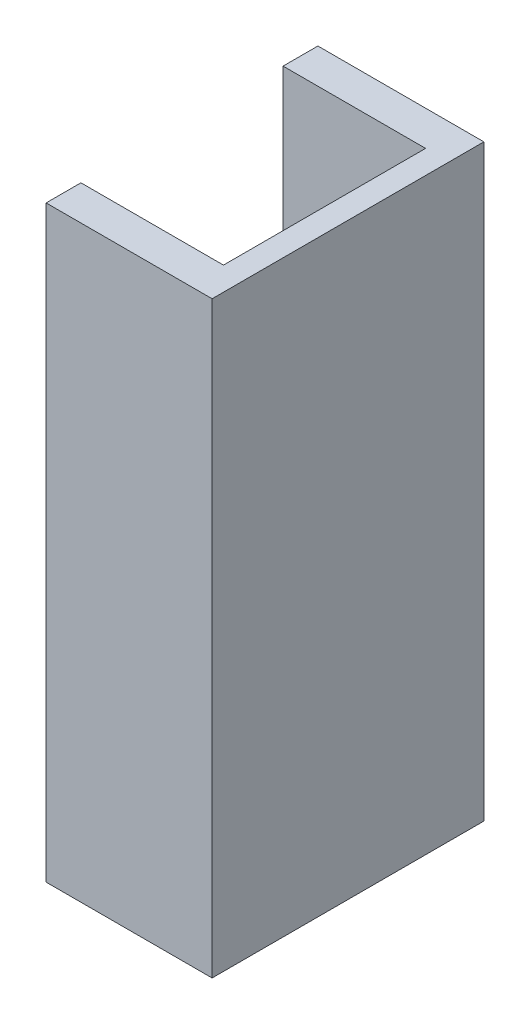
ISO-10303-21;
HEADER;
FILE_DESCRIPTION(('STEP AP214'),'2;1');
FILE_NAME('part.step','',(''),(''),'','','');
FILE_SCHEMA(('AUTOMOTIVE_DESIGN { 1 0 10303 214 1 1 1 1 }'));
ENDSEC;
DATA;
#1=APPLICATION_CONTEXT('core data for automotive mechanical design processes');
#2=APPLICATION_PROTOCOL_DEFINITION('international standard','automotive_design',2000,#1);
#3=PRODUCT_CONTEXT('',#1,'mechanical');
#4=PRODUCT('Part','Part','',(#3));
#5=PRODUCT_RELATED_PRODUCT_CATEGORY('part','',(#4));
#6=PRODUCT_DEFINITION_FORMATION('','',#4);
#7=PRODUCT_DEFINITION_CONTEXT('part definition',#1,'design');
#8=PRODUCT_DEFINITION('design','',#6,#7);
#9=PRODUCT_DEFINITION_SHAPE('','',#8);
#10=(LENGTH_UNIT() NAMED_UNIT(*) SI_UNIT(.MILLI.,.METRE.));
#11=(NAMED_UNIT(*) PLANE_ANGLE_UNIT() SI_UNIT($,.RADIAN.));
#12=(NAMED_UNIT(*) SI_UNIT($,.STERADIAN.) SOLID_ANGLE_UNIT());
#13=UNCERTAINTY_MEASURE_WITH_UNIT(LENGTH_MEASURE(1.E-05),#10,'distance_accuracy_value','');
#14=(GEOMETRIC_REPRESENTATION_CONTEXT(3) GLOBAL_UNCERTAINTY_ASSIGNED_CONTEXT((#13)) GLOBAL_UNIT_ASSIGNED_CONTEXT((#10,
#11,#12)) REPRESENTATION_CONTEXT('',''));
#15=CARTESIAN_POINT('',(0.,0.,0.));
#16=DIRECTION('',(0.,0.,1.));
#17=DIRECTION('',(1.,0.,0.));
#18=AXIS2_PLACEMENT_3D('',#15,#16,#17);
#19=CARTESIAN_POINT('',(18.9,-110.,18.9));
#20=DIRECTION('',(-1.,0.,0.));
#21=DIRECTION('',(0.,0.,1.));
#22=AXIS2_PLACEMENT_3D('',#19,#20,#21);
#23=PLANE('',#22);
#24=DIRECTION('',(0.,0.,1.));
#25=VECTOR('',#24,1.);
#26=CARTESIAN_POINT('',(18.9,0.,18.9));
#27=LINE('',#26,#25);
#28=CARTESIAN_POINT('',(18.9,0.,-18.9));
#29=VERTEX_POINT('',#28);
#30=CARTESIAN_POINT('',(18.9,0.,18.9));
#31=VERTEX_POINT('',#30);
#32=EDGE_CURVE('E148',#29,#31,#27,.T.);
#33=ORIENTED_EDGE('',*,*,#32,.F.);
#34=DIRECTION('',(0.,1.,0.));
#35=VECTOR('',#34,1.);
#36=CARTESIAN_POINT('',(18.9,-110.,-18.9));
#37=LINE('',#36,#35);
#38=CARTESIAN_POINT('',(18.9,-110.,-18.9));
#39=VERTEX_POINT('',#38);
#40=EDGE_CURVE('E11',#39,#29,#37,.T.);
#41=ORIENTED_EDGE('',*,*,#40,.F.);
#42=DIRECTION('',(0.,0.,1.));
#43=VECTOR('',#42,1.);
#44=CARTESIAN_POINT('',(18.9,-110.,18.9));
#45=LINE('',#44,#43);
#46=CARTESIAN_POINT('',(18.9,-110.,18.9));
#47=VERTEX_POINT('',#46);
#48=EDGE_CURVE('E176',#39,#47,#45,.T.);
#49=ORIENTED_EDGE('',*,*,#48,.T.);
#50=DIRECTION('',(0.,1.,0.));
#51=VECTOR('',#50,1.);
#52=CARTESIAN_POINT('',(18.9,-110.,18.9));
#53=LINE('',#52,#51);
#54=EDGE_CURVE('E48',#47,#31,#53,.T.);
#55=ORIENTED_EDGE('',*,*,#54,.T.);
#56=EDGE_LOOP('',(#33,#41,#49,#55));
#57=FACE_BOUND('',#56,.T.);
#58=ADVANCED_FACE('F45',(#57),#23,.T.);
#59=CARTESIAN_POINT('',(-7.75,-110.,-18.9));
#60=DIRECTION('',(0.,0.,1.));
#61=DIRECTION('',(1.,0.,0.));
#62=AXIS2_PLACEMENT_3D('',#59,#60,#61);
#63=PLANE('',#62);
#64=DIRECTION('',(1.,0.,0.));
#65=VECTOR('',#64,1.);
#66=CARTESIAN_POINT('',(-7.75,0.,-18.9));
#67=LINE('',#66,#65);
#68=CARTESIAN_POINT('',(-7.75,0.,-18.9));
#69=VERTEX_POINT('',#68);
#70=EDGE_CURVE('E173',#69,#29,#67,.T.);
#71=ORIENTED_EDGE('',*,*,#70,.F.);
#72=DIRECTION('',(0.,1.,0.));
#73=VECTOR('',#72,1.);
#74=CARTESIAN_POINT('',(-7.75,-110.,-18.9));
#75=LINE('',#74,#73);
#76=CARTESIAN_POINT('',(-7.75,-110.,-18.9));
#77=VERTEX_POINT('',#76);
#78=EDGE_CURVE('E55',#77,#69,#75,.T.);
#79=ORIENTED_EDGE('',*,*,#78,.F.);
#80=DIRECTION('',(1.,0.,0.));
#81=VECTOR('',#80,1.);
#82=CARTESIAN_POINT('',(-7.75,-110.,-18.9));
#83=LINE('',#82,#81);
#84=EDGE_CURVE('E134',#77,#39,#83,.T.);
#85=ORIENTED_EDGE('',*,*,#84,.T.);
#86=ORIENTED_EDGE('',*,*,#40,.T.);
#87=EDGE_LOOP('',(#71,#79,#85,#86));
#88=FACE_BOUND('',#87,.T.);
#89=ADVANCED_FACE('F194',(#88),#63,.T.);
#90=CARTESIAN_POINT('',(-7.75,-110.,-25.41));
#91=DIRECTION('',(-1.,0.,0.));
#92=DIRECTION('',(0.,0.,1.));
#93=AXIS2_PLACEMENT_3D('',#90,#91,#92);
#94=PLANE('',#93);
#95=DIRECTION('',(0.,0.,1.));
#96=VECTOR('',#95,1.);
#97=CARTESIAN_POINT('',(-7.75,0.,-25.41));
#98=LINE('',#97,#96);
#99=CARTESIAN_POINT('',(-7.75,0.,-25.41));
#100=VERTEX_POINT('',#99);
#101=EDGE_CURVE('E120',#100,#69,#98,.T.);
#102=ORIENTED_EDGE('',*,*,#101,.F.);
#103=DIRECTION('',(0.,1.,0.));
#104=VECTOR('',#103,1.);
#105=CARTESIAN_POINT('',(-7.75,-110.,-25.41));
#106=LINE('',#105,#104);
#107=CARTESIAN_POINT('',(-7.75,-110.,-25.41));
#108=VERTEX_POINT('',#107);
#109=EDGE_CURVE('E115',#108,#100,#106,.T.);
#110=ORIENTED_EDGE('',*,*,#109,.F.);
#111=DIRECTION('',(0.,0.,1.));
#112=VECTOR('',#111,1.);
#113=CARTESIAN_POINT('',(-7.75,-110.,-25.41));
#114=LINE('',#113,#112);
#115=EDGE_CURVE('E118',#108,#77,#114,.T.);
#116=ORIENTED_EDGE('',*,*,#115,.T.);
#117=ORIENTED_EDGE('',*,*,#78,.T.);
#118=EDGE_LOOP('',(#102,#110,#116,#117));
#119=FACE_BOUND('',#118,.T.);
#120=ADVANCED_FACE('F117',(#119),#94,.T.);
#121=CARTESIAN_POINT('',(-7.75,-110.,-25.41));
#122=DIRECTION('',(0.,0.,-1.));
#123=DIRECTION('',(-1.,0.,0.));
#124=AXIS2_PLACEMENT_3D('',#121,#122,#123);
#125=PLANE('',#124);
#126=DIRECTION('',(-1.,0.,0.));
#127=VECTOR('',#126,1.);
#128=CARTESIAN_POINT('',(-7.75,0.,-25.41));
#129=LINE('',#128,#127);
#130=CARTESIAN_POINT('',(23.29,0.,-25.41));
#131=VERTEX_POINT('',#130);
#132=EDGE_CURVE('E168',#131,#100,#129,.T.);
#133=ORIENTED_EDGE('',*,*,#132,.F.);
#134=DIRECTION('',(0.,1.,0.));
#135=VECTOR('',#134,1.);
#136=CARTESIAN_POINT('',(23.29,-110.,-25.41));
#137=LINE('',#136,#135);
#138=CARTESIAN_POINT('',(23.29,-110.,-25.41));
#139=VERTEX_POINT('',#138);
#140=EDGE_CURVE('E126',#139,#131,#137,.T.);
#141=ORIENTED_EDGE('',*,*,#140,.F.);
#142=DIRECTION('',(-1.,0.,0.));
#143=VECTOR('',#142,1.);
#144=CARTESIAN_POINT('',(-7.75,-110.,-25.41));
#145=LINE('',#144,#143);
#146=EDGE_CURVE('E132',#139,#108,#145,.T.);
#147=ORIENTED_EDGE('',*,*,#146,.T.);
#148=ORIENTED_EDGE('',*,*,#109,.T.);
#149=EDGE_LOOP('',(#133,#141,#147,#148));
#150=FACE_BOUND('',#149,.T.);
#151=ADVANCED_FACE('F137',(#150),#125,.T.);
#152=CARTESIAN_POINT('',(23.29,-110.,25.41));
#153=DIRECTION('',(1.,0.,0.));
#154=DIRECTION('',(0.,0.,-1.));
#155=AXIS2_PLACEMENT_3D('',#152,#153,#154);
#156=PLANE('',#155);
#157=DIRECTION('',(0.,0.,-1.));
#158=VECTOR('',#157,1.);
#159=CARTESIAN_POINT('',(23.29,0.,25.41));
#160=LINE('',#159,#158);
#161=CARTESIAN_POINT('',(23.29,0.,25.41));
#162=VERTEX_POINT('',#161);
#163=EDGE_CURVE('E164',#162,#131,#160,.T.);
#164=ORIENTED_EDGE('',*,*,#163,.F.);
#165=DIRECTION('',(0.,1.,0.));
#166=VECTOR('',#165,1.);
#167=CARTESIAN_POINT('',(23.29,-110.,25.41));
#168=LINE('',#167,#166);
#169=CARTESIAN_POINT('',(23.29,-110.,25.41));
#170=VERTEX_POINT('',#169);
#171=EDGE_CURVE('E182',#170,#162,#168,.T.);
#172=ORIENTED_EDGE('',*,*,#171,.F.);
#173=DIRECTION('',(0.,0.,-1.));
#174=VECTOR('',#173,1.);
#175=CARTESIAN_POINT('',(23.29,-110.,25.41));
#176=LINE('',#175,#174);
#177=EDGE_CURVE('E139',#170,#139,#176,.T.);
#178=ORIENTED_EDGE('',*,*,#177,.T.);
#179=ORIENTED_EDGE('',*,*,#140,.T.);
#180=EDGE_LOOP('',(#164,#172,#178,#179));
#181=FACE_BOUND('',#180,.T.);
#182=ADVANCED_FACE('F207',(#181),#156,.T.);
#183=CARTESIAN_POINT('',(-7.75,-110.,25.41));
#184=DIRECTION('',(0.,0.,1.));
#185=DIRECTION('',(1.,0.,0.));
#186=AXIS2_PLACEMENT_3D('',#183,#184,#185);
#187=PLANE('',#186);
#188=DIRECTION('',(1.,0.,0.));
#189=VECTOR('',#188,1.);
#190=CARTESIAN_POINT('',(-7.75,0.,25.41));
#191=LINE('',#190,#189);
#192=CARTESIAN_POINT('',(-7.75,0.,25.41));
#193=VERTEX_POINT('',#192);
#194=EDGE_CURVE('E160',#193,#162,#191,.T.);
#195=ORIENTED_EDGE('',*,*,#194,.F.);
#196=DIRECTION('',(0.,1.,0.));
#197=VECTOR('',#196,1.);
#198=CARTESIAN_POINT('',(-7.75,-110.,25.41));
#199=LINE('',#198,#197);
#200=CARTESIAN_POINT('',(-7.75,-110.,25.41));
#201=VERTEX_POINT('',#200);
#202=EDGE_CURVE('E185',#201,#193,#199,.T.);
#203=ORIENTED_EDGE('',*,*,#202,.F.);
#204=DIRECTION('',(1.,0.,0.));
#205=VECTOR('',#204,1.);
#206=CARTESIAN_POINT('',(-7.75,-110.,25.41));
#207=LINE('',#206,#205);
#208=EDGE_CURVE('E142',#201,#170,#207,.T.);
#209=ORIENTED_EDGE('',*,*,#208,.T.);
#210=ORIENTED_EDGE('',*,*,#171,.T.);
#211=EDGE_LOOP('',(#195,#203,#209,#210));
#212=FACE_BOUND('',#211,.T.);
#213=ADVANCED_FACE('F210',(#212),#187,.T.);
#214=CARTESIAN_POINT('',(-7.75,-110.,18.9));
#215=DIRECTION('',(-1.,0.,0.));
#216=DIRECTION('',(0.,0.,1.));
#217=AXIS2_PLACEMENT_3D('',#214,#215,#216);
#218=PLANE('',#217);
#219=DIRECTION('',(0.,0.,1.));
#220=VECTOR('',#219,1.);
#221=CARTESIAN_POINT('',(-7.75,0.,18.9));
#222=LINE('',#221,#220);
#223=CARTESIAN_POINT('',(-7.75,0.,18.9));
#224=VERTEX_POINT('',#223);
#225=EDGE_CURVE('E156',#224,#193,#222,.T.);
#226=ORIENTED_EDGE('',*,*,#225,.F.);
#227=DIRECTION('',(0.,1.,0.));
#228=VECTOR('',#227,1.);
#229=CARTESIAN_POINT('',(-7.75,-110.,18.9));
#230=LINE('',#229,#228);
#231=CARTESIAN_POINT('',(-7.75,-110.,18.9));
#232=VERTEX_POINT('',#231);
#233=EDGE_CURVE('E187',#232,#224,#230,.T.);
#234=ORIENTED_EDGE('',*,*,#233,.F.);
#235=DIRECTION('',(0.,0.,1.));
#236=VECTOR('',#235,1.);
#237=CARTESIAN_POINT('',(-7.75,-110.,18.9));
#238=LINE('',#237,#236);
#239=EDGE_CURVE('E291',#232,#201,#238,.T.);
#240=ORIENTED_EDGE('',*,*,#239,.T.);
#241=ORIENTED_EDGE('',*,*,#202,.T.);
#242=EDGE_LOOP('',(#226,#234,#240,#241));
#243=FACE_BOUND('',#242,.T.);
#244=ADVANCED_FACE('F214',(#243),#218,.T.);
#245=CARTESIAN_POINT('',(-7.75,-110.,18.9));
#246=DIRECTION('',(0.,0.,-1.));
#247=DIRECTION('',(-1.,0.,0.));
#248=AXIS2_PLACEMENT_3D('',#245,#246,#247);
#249=PLANE('',#248);
#250=DIRECTION('',(-1.,0.,0.));
#251=VECTOR('',#250,1.);
#252=CARTESIAN_POINT('',(-7.75,0.,18.9));
#253=LINE('',#252,#251);
#254=EDGE_CURVE('E152',#31,#224,#253,.T.);
#255=ORIENTED_EDGE('',*,*,#254,.F.);
#256=ORIENTED_EDGE('',*,*,#54,.F.);
#257=DIRECTION('',(-1.,0.,0.));
#258=VECTOR('',#257,1.);
#259=CARTESIAN_POINT('',(-7.75,-110.,18.9));
#260=LINE('',#259,#258);
#261=EDGE_CURVE('E294',#47,#232,#260,.T.);
#262=ORIENTED_EDGE('',*,*,#261,.T.);
#263=ORIENTED_EDGE('',*,*,#233,.T.);
#264=EDGE_LOOP('',(#255,#256,#262,#263));
#265=FACE_BOUND('',#264,.T.);
#266=ADVANCED_FACE('F191',(#265),#249,.T.);
#267=CARTESIAN_POINT('',(0.,-110.,0.));
#268=DIRECTION('',(0.,-1.,0.));
#269=DIRECTION('',(0.,0.,-1.));
#270=AXIS2_PLACEMENT_3D('',#267,#268,#269);
#271=PLANE('',#270);
#272=ORIENTED_EDGE('',*,*,#48,.F.);
#273=ORIENTED_EDGE('',*,*,#84,.F.);
#274=ORIENTED_EDGE('',*,*,#115,.F.);
#275=ORIENTED_EDGE('',*,*,#146,.F.);
#276=ORIENTED_EDGE('',*,*,#177,.F.);
#277=ORIENTED_EDGE('',*,*,#208,.F.);
#278=ORIENTED_EDGE('',*,*,#239,.F.);
#279=ORIENTED_EDGE('',*,*,#261,.F.);
#280=EDGE_LOOP('',(#272,#273,#274,#275,#276,#277,#278,#279));
#281=FACE_BOUND('',#280,.T.);
#282=ADVANCED_FACE('F130',(#281),#271,.T.);
#283=CARTESIAN_POINT('',(0.,0.,0.));
#284=DIRECTION('',(0.,-1.,0.));
#285=DIRECTION('',(0.,0.,-1.));
#286=AXIS2_PLACEMENT_3D('',#283,#284,#285);
#287=PLANE('',#286);
#288=ORIENTED_EDGE('',*,*,#32,.T.);
#289=ORIENTED_EDGE('',*,*,#254,.T.);
#290=ORIENTED_EDGE('',*,*,#225,.T.);
#291=ORIENTED_EDGE('',*,*,#194,.T.);
#292=ORIENTED_EDGE('',*,*,#163,.T.);
#293=ORIENTED_EDGE('',*,*,#132,.T.);
#294=ORIENTED_EDGE('',*,*,#101,.T.);
#295=ORIENTED_EDGE('',*,*,#70,.T.);
#296=EDGE_LOOP('',(#288,#289,#290,#291,#292,#293,#294,#295));
#297=FACE_BOUND('',#296,.T.);
#298=ADVANCED_FACE('F193',(#297),#287,.F.);
#299=CLOSED_SHELL('',(#58,#89,#120,#151,#182,#213,#244,#266,#282,#298));
#300=MANIFOLD_SOLID_BREP('B2',#299);
#301=ADVANCED_BREP_SHAPE_REPRESENTATION('',(#18,#300),#14);
#302=SHAPE_DEFINITION_REPRESENTATION(#9,#301);
ENDSEC;
END-ISO-10303-21;
